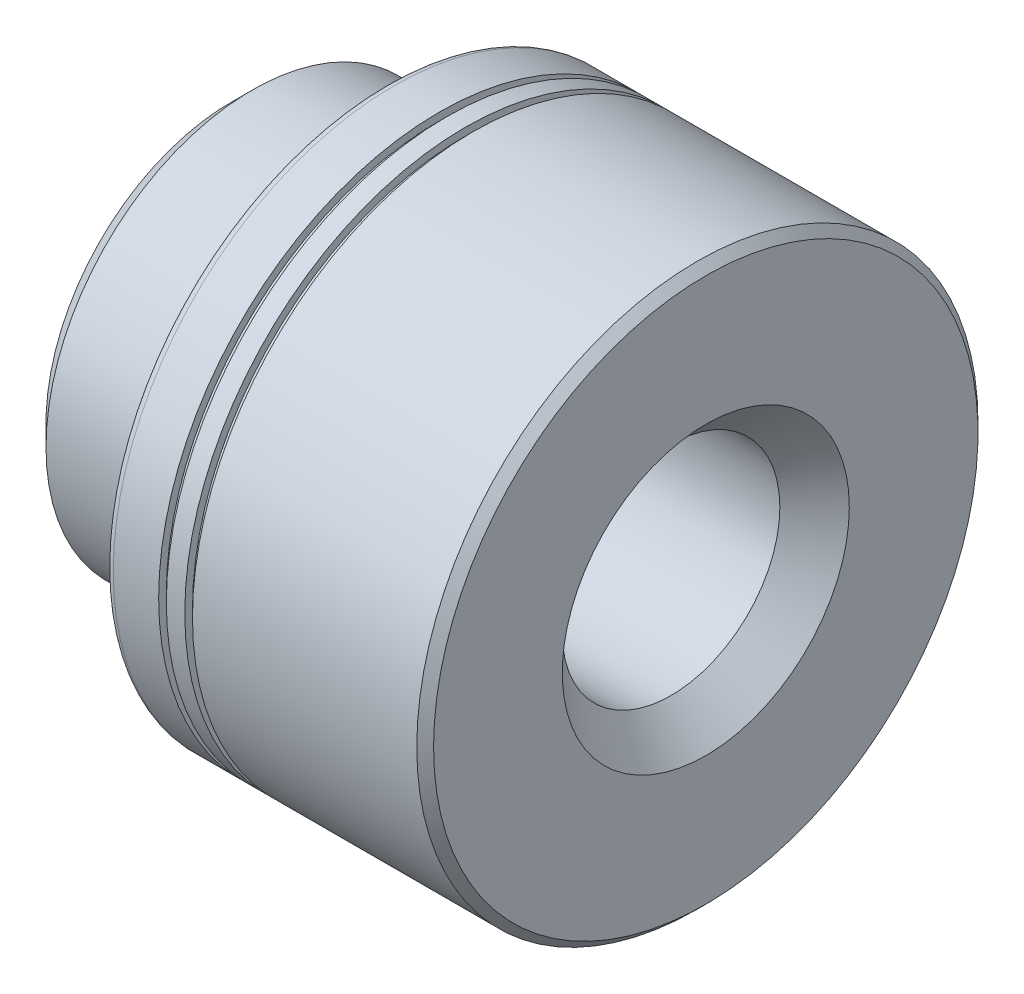
ISO-10303-21;
HEADER;
FILE_DESCRIPTION(('STEP AP214'),'2;1');
FILE_NAME('part.step','',(''),(''),'','','');
FILE_SCHEMA(('AUTOMOTIVE_DESIGN { 1 0 10303 214 1 1 1 1 }'));
ENDSEC;
DATA;
#1=APPLICATION_CONTEXT('core data for automotive mechanical design processes');
#2=APPLICATION_PROTOCOL_DEFINITION('international standard','automotive_design',2000,#1);
#3=PRODUCT_CONTEXT('',#1,'mechanical');
#4=PRODUCT('Part','Part','',(#3));
#5=PRODUCT_RELATED_PRODUCT_CATEGORY('part','',(#4));
#6=PRODUCT_DEFINITION_FORMATION('','',#4);
#7=PRODUCT_DEFINITION_CONTEXT('part definition',#1,'design');
#8=PRODUCT_DEFINITION('design','',#6,#7);
#9=PRODUCT_DEFINITION_SHAPE('','',#8);
#10=(LENGTH_UNIT() NAMED_UNIT(*) SI_UNIT(.MILLI.,.METRE.));
#11=(NAMED_UNIT(*) PLANE_ANGLE_UNIT() SI_UNIT($,.RADIAN.));
#12=(NAMED_UNIT(*) SI_UNIT($,.STERADIAN.) SOLID_ANGLE_UNIT());
#13=UNCERTAINTY_MEASURE_WITH_UNIT(LENGTH_MEASURE(1.E-05),#10,'distance_accuracy_value','');
#14=(GEOMETRIC_REPRESENTATION_CONTEXT(3) GLOBAL_UNCERTAINTY_ASSIGNED_CONTEXT((#13)) GLOBAL_UNIT_ASSIGNED_CONTEXT((#10,
#11,#12)) REPRESENTATION_CONTEXT('',''));
#15=CARTESIAN_POINT('',(0.,0.,0.));
#16=DIRECTION('',(0.,0.,1.));
#17=DIRECTION('',(1.,0.,0.));
#18=AXIS2_PLACEMENT_3D('',#15,#16,#17);
#19=CARTESIAN_POINT('',(1.607439,0.,0.));
#20=DIRECTION('',(-1.,0.,0.));
#21=DIRECTION('',(0.,0.,1.));
#22=AXIS2_PLACEMENT_3D('',#19,#20,#21);
#23=TOROIDAL_SURFACE('',#22,2.697861,0.0834389999999999);
#24=CARTESIAN_POINT('',(1.607439,0.,0.));
#25=DIRECTION('',(-1.,0.,0.));
#26=DIRECTION('',(0.,0.,1.));
#27=AXIS2_PLACEMENT_3D('',#24,#25,#26);
#28=CIRCLE('',#27,2.7813);
#29=CARTESIAN_POINT('',(1.607439,0.,2.7813));
#30=VERTEX_POINT('',#29);
#31=EDGE_CURVE('E44',#30,#30,#28,.F.);
#32=ORIENTED_EDGE('',*,*,#31,.F.);
#33=EDGE_LOOP('',(#32));
#34=FACE_BOUND('',#33,.T.);
#35=CARTESIAN_POINT('',(1.524,0.,0.));
#36=DIRECTION('',(1.,0.,0.));
#37=DIRECTION('',(0.,0.,-1.));
#38=AXIS2_PLACEMENT_3D('',#35,#36,#37);
#39=CIRCLE('',#38,2.697861);
#40=CARTESIAN_POINT('',(1.524,0.,2.697861));
#41=VERTEX_POINT('',#40);
#42=CARTESIAN_POINT('',(1.524,0.,-2.697861));
#43=VERTEX_POINT('',#42);
#44=EDGE_CURVE('E34',#41,#43,#39,.F.);
#45=ORIENTED_EDGE('',*,*,#44,.F.);
#46=CARTESIAN_POINT('',(1.524,0.,0.));
#47=DIRECTION('',(1.,0.,0.));
#48=DIRECTION('',(0.,0.,1.));
#49=AXIS2_PLACEMENT_3D('',#46,#47,#48);
#50=CIRCLE('',#49,2.697861);
#51=EDGE_CURVE('E37',#43,#41,#50,.F.);
#52=ORIENTED_EDGE('',*,*,#51,.F.);
#53=EDGE_LOOP('',(#45,#52));
#54=FACE_BOUND('',#53,.T.);
#55=ADVANCED_FACE('F16',(#34,#54),#23,.T.);
#56=CARTESIAN_POINT('',(1.524,0.,-2.3712805));
#57=DIRECTION('',(-1.,0.,0.));
#58=DIRECTION('',(0.,0.,1.));
#59=AXIS2_PLACEMENT_3D('',#56,#57,#58);
#60=PLANE('',#59);
#61=ORIENTED_EDGE('',*,*,#51,.T.);
#62=ORIENTED_EDGE('',*,*,#44,.T.);
#63=EDGE_LOOP('',(#61,#62));
#64=FACE_BOUND('',#63,.T.);
#65=CARTESIAN_POINT('',(1.524,0.,0.));
#66=DIRECTION('',(-1.,0.,0.));
#67=DIRECTION('',(0.,0.,1.));
#68=AXIS2_PLACEMENT_3D('',#65,#66,#67);
#69=CIRCLE('',#68,2.0447);
#70=CARTESIAN_POINT('',(1.524,0.,2.0447));
#71=VERTEX_POINT('',#70);
#72=EDGE_CURVE('E176',#71,#71,#69,.T.);
#73=ORIENTED_EDGE('',*,*,#72,.F.);
#74=EDGE_LOOP('',(#73));
#75=FACE_BOUND('',#74,.T.);
#76=ADVANCED_FACE('F42',(#64,#75),#60,.T.);
#77=CARTESIAN_POINT('',(1.8324195,0.,0.));
#78=DIRECTION('',(-1.,0.,0.));
#79=DIRECTION('',(0.,0.,1.));
#80=AXIS2_PLACEMENT_3D('',#77,#78,#79);
#81=CYLINDRICAL_SURFACE('',#80,2.7813);
#82=ORIENTED_EDGE('',*,*,#31,.T.);
#83=EDGE_LOOP('',(#82));
#84=FACE_BOUND('',#83,.T.);
#85=CARTESIAN_POINT('',(2.0574,0.,0.));
#86=DIRECTION('',(-1.,0.,0.));
#87=DIRECTION('',(0.,0.,1.));
#88=AXIS2_PLACEMENT_3D('',#85,#86,#87);
#89=CIRCLE('',#88,2.7813);
#90=CARTESIAN_POINT('',(2.0574,0.,2.7813));
#91=VERTEX_POINT('',#90);
#92=EDGE_CURVE('E174',#91,#91,#89,.F.);
#93=ORIENTED_EDGE('',*,*,#92,.F.);
#94=EDGE_LOOP('',(#93));
#95=FACE_BOUND('',#94,.T.);
#96=ADVANCED_FACE('F60',(#84,#95),#81,.T.);
#97=CARTESIAN_POINT('',(0.864235,0.,0.));
#98=DIRECTION('',(-1.,0.,0.));
#99=DIRECTION('',(0.,0.,1.));
#100=AXIS2_PLACEMENT_3D('',#97,#98,#99);
#101=CYLINDRICAL_SURFACE('',#100,2.0447);
#102=CARTESIAN_POINT('',(0.204469999971479,0.,0.));
#103=DIRECTION('',(1.,0.,0.));
#104=DIRECTION('',(0.,0.,-1.));
#105=AXIS2_PLACEMENT_3D('',#102,#103,#104);
#106=CIRCLE('',#105,2.04470000005585);
#107=CARTESIAN_POINT('',(0.204469999971479,0.,-2.04470000005585));
#108=VERTEX_POINT('',#107);
#109=EDGE_CURVE('E173',#108,#108,#106,.F.);
#110=ORIENTED_EDGE('',*,*,#109,.F.);
#111=EDGE_LOOP('',(#110));
#112=FACE_BOUND('',#111,.T.);
#113=ORIENTED_EDGE('',*,*,#72,.T.);
#114=EDGE_LOOP('',(#113));
#115=FACE_BOUND('',#114,.T.);
#116=ADVANCED_FACE('F64',(#112,#115),#101,.T.);
#117=CARTESIAN_POINT('',(2.0574,0.,-2.7432));
#118=DIRECTION('',(1.,0.,0.));
#119=DIRECTION('',(0.,0.,-1.));
#120=AXIS2_PLACEMENT_3D('',#117,#118,#119);
#121=PLANE('',#120);
#122=CARTESIAN_POINT('',(2.0574,0.,0.));
#123=DIRECTION('',(-1.,0.,0.));
#124=DIRECTION('',(0.,0.,1.));
#125=AXIS2_PLACEMENT_3D('',#122,#123,#124);
#126=CIRCLE('',#125,2.7051);
#127=CARTESIAN_POINT('',(2.0574,0.,2.7051));
#128=VERTEX_POINT('',#127);
#129=EDGE_CURVE('E170',#128,#128,#126,.F.);
#130=ORIENTED_EDGE('',*,*,#129,.F.);
#131=EDGE_LOOP('',(#130));
#132=FACE_BOUND('',#131,.T.);
#133=ORIENTED_EDGE('',*,*,#92,.T.);
#134=EDGE_LOOP('',(#133));
#135=FACE_BOUND('',#134,.T.);
#136=ADVANCED_FACE('F68',(#132,#135),#121,.T.);
#137=CARTESIAN_POINT('',(0.204470000085166,0.,0.));
#138=DIRECTION('',(1.,0.,0.));
#139=DIRECTION('',(0.,0.,-1.));
#140=AXIS2_PLACEMENT_3D('',#137,#138,#139);
#141=CONICAL_SURFACE('',#140,2.0447000001127,0.785398163397448);
#142=CARTESIAN_POINT('',(5.68430936001563E-11,0.,0.));
#143=DIRECTION('',(1.,0.,0.));
#144=DIRECTION('',(0.,0.,-1.));
#145=AXIS2_PLACEMENT_3D('',#142,#143,#144);
#146=CIRCLE('',#145,1.84023000008437);
#147=CARTESIAN_POINT('',(5.68432033756262E-11,0.,-1.84023000008437));
#148=VERTEX_POINT('',#147);
#149=EDGE_CURVE('E167',#148,#148,#146,.F.);
#150=ORIENTED_EDGE('',*,*,#149,.F.);
#151=EDGE_LOOP('',(#150));
#152=FACE_BOUND('',#151,.T.);
#153=ORIENTED_EDGE('',*,*,#109,.T.);
#154=EDGE_LOOP('',(#153));
#155=FACE_BOUND('',#154,.T.);
#156=ADVANCED_FACE('F72',(#152,#155),#141,.T.);
#157=CARTESIAN_POINT('',(2.0955,0.,0.));
#158=DIRECTION('',(-1.,0.,0.));
#159=DIRECTION('',(0.,0.,1.));
#160=AXIS2_PLACEMENT_3D('',#157,#158,#159);
#161=CYLINDRICAL_SURFACE('',#160,2.7051);
#162=ORIENTED_EDGE('',*,*,#129,.T.);
#163=EDGE_LOOP('',(#162));
#164=FACE_BOUND('',#163,.T.);
#165=CARTESIAN_POINT('',(2.1336,0.,0.));
#166=DIRECTION('',(-1.,0.,0.));
#167=DIRECTION('',(0.,0.,1.));
#168=AXIS2_PLACEMENT_3D('',#165,#166,#167);
#169=CIRCLE('',#168,2.7051);
#170=CARTESIAN_POINT('',(2.1336,0.,2.7051));
#171=VERTEX_POINT('',#170);
#172=EDGE_CURVE('E164',#171,#171,#169,.F.);
#173=ORIENTED_EDGE('',*,*,#172,.F.);
#174=EDGE_LOOP('',(#173));
#175=FACE_BOUND('',#174,.T.);
#176=ADVANCED_FACE('F76',(#164,#175),#161,.T.);
#177=CARTESIAN_POINT('',(0.,0.,-0.920115));
#178=DIRECTION('',(-1.,0.,0.));
#179=DIRECTION('',(0.,0.,1.));
#180=AXIS2_PLACEMENT_3D('',#177,#178,#179);
#181=PLANE('',#180);
#182=ORIENTED_EDGE('',*,*,#149,.T.);
#183=EDGE_LOOP('',(#182));
#184=FACE_BOUND('',#183,.T.);
#185=CARTESIAN_POINT('',(0.,0.,0.));
#186=DIRECTION('',(-1.,0.,0.));
#187=DIRECTION('',(0.,0.,1.));
#188=AXIS2_PLACEMENT_3D('',#185,#186,#187);
#189=CIRCLE('',#188,1.42239999996718);
#190=CARTESIAN_POINT('',(0.,0.,1.42239999996718));
#191=VERTEX_POINT('',#190);
#192=EDGE_CURVE('E161',#191,#191,#189,.F.);
#193=ORIENTED_EDGE('',*,*,#192,.T.);
#194=EDGE_LOOP('',(#193));
#195=FACE_BOUND('',#194,.T.);
#196=ADVANCED_FACE('F80',(#184,#195),#181,.T.);
#197=CARTESIAN_POINT('',(2.1336,0.,-2.7432));
#198=DIRECTION('',(-1.,0.,0.));
#199=DIRECTION('',(0.,0.,1.));
#200=AXIS2_PLACEMENT_3D('',#197,#198,#199);
#201=PLANE('',#200);
#202=CARTESIAN_POINT('',(2.1336,0.,0.));
#203=DIRECTION('',(-1.,0.,0.));
#204=DIRECTION('',(0.,0.,1.));
#205=AXIS2_PLACEMENT_3D('',#202,#203,#204);
#206=CIRCLE('',#205,2.7813);
#207=CARTESIAN_POINT('',(2.1336,0.,2.7813));
#208=VERTEX_POINT('',#207);
#209=EDGE_CURVE('E158',#208,#208,#206,.F.);
#210=ORIENTED_EDGE('',*,*,#209,.F.);
#211=EDGE_LOOP('',(#210));
#212=FACE_BOUND('',#211,.T.);
#213=ORIENTED_EDGE('',*,*,#172,.T.);
#214=EDGE_LOOP('',(#213));
#215=FACE_BOUND('',#214,.T.);
#216=ADVANCED_FACE('F84',(#212,#215),#201,.T.);
#217=CARTESIAN_POINT('',(5.68431575787964E-11,0.,0.));
#218=DIRECTION('',(-1.,0.,0.));
#219=DIRECTION('',(0.,0.,1.));
#220=AXIS2_PLACEMENT_3D('',#217,#218,#219);
#221=CONICAL_SURFACE('',#220,1.42239999991034,0.785398163480029);
#222=ORIENTED_EDGE('',*,*,#192,.F.);
#223=EDGE_LOOP('',(#222));
#224=FACE_BOUND('',#223,.T.);
#225=CARTESIAN_POINT('',(0.34417,0.,0.));
#226=DIRECTION('',(-1.,0.,0.));
#227=DIRECTION('',(0.,0.,1.));
#228=AXIS2_PLACEMENT_3D('',#225,#226,#227);
#229=CIRCLE('',#228,1.07823);
#230=CARTESIAN_POINT('',(0.34417,0.,1.07823));
#231=VERTEX_POINT('',#230);
#232=EDGE_CURVE('E157',#231,#231,#229,.F.);
#233=ORIENTED_EDGE('',*,*,#232,.T.);
#234=EDGE_LOOP('',(#233));
#235=FACE_BOUND('',#234,.T.);
#236=ADVANCED_FACE('F88',(#224,#235),#221,.F.);
#237=CARTESIAN_POINT('',(2.22504,0.,0.));
#238=DIRECTION('',(-1.,0.,0.));
#239=DIRECTION('',(0.,0.,1.));
#240=AXIS2_PLACEMENT_3D('',#237,#238,#239);
#241=CYLINDRICAL_SURFACE('',#240,2.7813);
#242=ORIENTED_EDGE('',*,*,#209,.T.);
#243=EDGE_LOOP('',(#242));
#244=FACE_BOUND('',#243,.T.);
#245=CARTESIAN_POINT('',(2.31648,0.,0.));
#246=DIRECTION('',(-1.,0.,0.));
#247=DIRECTION('',(0.,0.,1.));
#248=AXIS2_PLACEMENT_3D('',#245,#246,#247);
#249=CIRCLE('',#248,2.7813);
#250=CARTESIAN_POINT('',(2.31648,0.,2.7813));
#251=VERTEX_POINT('',#250);
#252=EDGE_CURVE('E154',#251,#251,#249,.F.);
#253=ORIENTED_EDGE('',*,*,#252,.F.);
#254=EDGE_LOOP('',(#253));
#255=FACE_BOUND('',#254,.T.);
#256=ADVANCED_FACE('F92',(#244,#255),#241,.T.);
#257=CARTESIAN_POINT('',(2.3495,0.,0.));
#258=DIRECTION('',(-1.,0.,0.));
#259=DIRECTION('',(0.,0.,1.));
#260=AXIS2_PLACEMENT_3D('',#257,#258,#259);
#261=CYLINDRICAL_SURFACE('',#260,1.07823);
#262=ORIENTED_EDGE('',*,*,#232,.F.);
#263=EDGE_LOOP('',(#262));
#264=FACE_BOUND('',#263,.T.);
#265=CARTESIAN_POINT('',(4.35483000001113,0.,0.));
#266=DIRECTION('',(1.,0.,0.));
#267=DIRECTION('',(0.,0.,-1.));
#268=AXIS2_PLACEMENT_3D('',#265,#266,#267);
#269=CIRCLE('',#268,1.07822999996188);
#270=CARTESIAN_POINT('',(4.35483000001113,0.,-1.07822999996188));
#271=VERTEX_POINT('',#270);
#272=EDGE_CURVE('E153',#271,#271,#269,.T.);
#273=ORIENTED_EDGE('',*,*,#272,.T.);
#274=EDGE_LOOP('',(#273));
#275=FACE_BOUND('',#274,.T.);
#276=ADVANCED_FACE('F96',(#264,#275),#261,.F.);
#277=CARTESIAN_POINT('',(2.31648,0.,-2.7432));
#278=DIRECTION('',(1.,0.,0.));
#279=DIRECTION('',(0.,0.,-1.));
#280=AXIS2_PLACEMENT_3D('',#277,#278,#279);
#281=PLANE('',#280);
#282=CARTESIAN_POINT('',(2.31648,0.,0.));
#283=DIRECTION('',(-1.,0.,0.));
#284=DIRECTION('',(0.,0.,1.));
#285=AXIS2_PLACEMENT_3D('',#282,#283,#284);
#286=CIRCLE('',#285,2.7051);
#287=CARTESIAN_POINT('',(2.31648,0.,2.7051));
#288=VERTEX_POINT('',#287);
#289=EDGE_CURVE('E150',#288,#288,#286,.F.);
#290=ORIENTED_EDGE('',*,*,#289,.F.);
#291=EDGE_LOOP('',(#290));
#292=FACE_BOUND('',#291,.T.);
#293=ORIENTED_EDGE('',*,*,#252,.T.);
#294=EDGE_LOOP('',(#293));
#295=FACE_BOUND('',#294,.T.);
#296=ADVANCED_FACE('F100',(#292,#295),#281,.T.);
#297=CARTESIAN_POINT('',(4.69900000001644,0.,0.));
#298=DIRECTION('',(1.,0.,0.));
#299=DIRECTION('',(0.,0.,-1.));
#300=AXIS2_PLACEMENT_3D('',#297,#298,#299);
#301=CONICAL_SURFACE('',#300,1.42239999996718,0.785398163397448);
#302=ORIENTED_EDGE('',*,*,#272,.F.);
#303=EDGE_LOOP('',(#302));
#304=FACE_BOUND('',#303,.T.);
#305=CARTESIAN_POINT('',(4.69900000001644,0.,0.));
#306=DIRECTION('',(1.,0.,0.));
#307=DIRECTION('',(0.,0.,-1.));
#308=AXIS2_PLACEMENT_3D('',#305,#306,#307);
#309=CIRCLE('',#308,1.42239999996718);
#310=CARTESIAN_POINT('',(4.69900000001644,0.,-1.42239999996718));
#311=VERTEX_POINT('',#310);
#312=EDGE_CURVE('E147',#311,#311,#309,.F.);
#313=ORIENTED_EDGE('',*,*,#312,.F.);
#314=EDGE_LOOP('',(#313));
#315=FACE_BOUND('',#314,.T.);
#316=ADVANCED_FACE('F104',(#304,#315),#301,.F.);
#317=CARTESIAN_POINT('',(2.35458,0.,0.));
#318=DIRECTION('',(-1.,0.,0.));
#319=DIRECTION('',(0.,0.,1.));
#320=AXIS2_PLACEMENT_3D('',#317,#318,#319);
#321=CYLINDRICAL_SURFACE('',#320,2.7051);
#322=ORIENTED_EDGE('',*,*,#289,.T.);
#323=EDGE_LOOP('',(#322));
#324=FACE_BOUND('',#323,.T.);
#325=CARTESIAN_POINT('',(2.39268,0.,0.));
#326=DIRECTION('',(-1.,0.,0.));
#327=DIRECTION('',(0.,0.,1.));
#328=AXIS2_PLACEMENT_3D('',#325,#326,#327);
#329=CIRCLE('',#328,2.7051);
#330=CARTESIAN_POINT('',(2.39268,0.,2.7051));
#331=VERTEX_POINT('',#330);
#332=EDGE_CURVE('E139',#331,#331,#329,.F.);
#333=ORIENTED_EDGE('',*,*,#332,.F.);
#334=EDGE_LOOP('',(#333));
#335=FACE_BOUND('',#334,.T.);
#336=ADVANCED_FACE('F108',(#324,#335),#321,.T.);
#337=CARTESIAN_POINT('',(4.699,0.,-1.3489305));
#338=DIRECTION('',(1.,0.,0.));
#339=DIRECTION('',(0.,0.,-1.));
#340=AXIS2_PLACEMENT_3D('',#337,#338,#339);
#341=PLANE('',#340);
#342=CARTESIAN_POINT('',(4.6989999999596,0.,0.));
#343=DIRECTION('',(-1.,0.,0.));
#344=DIRECTION('',(0.,0.,1.));
#345=AXIS2_PLACEMENT_3D('',#342,#343,#344);
#346=CIRCLE('',#345,2.69786100005831);
#347=CARTESIAN_POINT('',(4.6989999999596,0.,2.69786100005831));
#348=VERTEX_POINT('',#347);
#349=EDGE_CURVE('E136',#348,#348,#346,.T.);
#350=ORIENTED_EDGE('',*,*,#349,.F.);
#351=EDGE_LOOP('',(#350));
#352=FACE_BOUND('',#351,.T.);
#353=ORIENTED_EDGE('',*,*,#312,.T.);
#354=EDGE_LOOP('',(#353));
#355=FACE_BOUND('',#354,.T.);
#356=ADVANCED_FACE('F112',(#352,#355),#341,.T.);
#357=CARTESIAN_POINT('',(2.39268,0.,-2.7432));
#358=DIRECTION('',(-1.,0.,0.));
#359=DIRECTION('',(0.,0.,1.));
#360=AXIS2_PLACEMENT_3D('',#357,#358,#359);
#361=PLANE('',#360);
#362=CARTESIAN_POINT('',(2.39268,0.,0.));
#363=DIRECTION('',(-1.,0.,0.));
#364=DIRECTION('',(0.,0.,1.));
#365=AXIS2_PLACEMENT_3D('',#362,#363,#364);
#366=CIRCLE('',#365,2.7813);
#367=CARTESIAN_POINT('',(2.39268,0.,2.7813));
#368=VERTEX_POINT('',#367);
#369=EDGE_CURVE('E27',#368,#368,#366,.F.);
#370=ORIENTED_EDGE('',*,*,#369,.F.);
#371=EDGE_LOOP('',(#370));
#372=FACE_BOUND('',#371,.T.);
#373=ORIENTED_EDGE('',*,*,#332,.T.);
#374=EDGE_LOOP('',(#373));
#375=FACE_BOUND('',#374,.T.);
#376=ADVANCED_FACE('F116',(#372,#375),#361,.T.);
#377=CARTESIAN_POINT('',(4.61556099980953,0.,0.));
#378=DIRECTION('',(-1.,0.,0.));
#379=DIRECTION('',(0.,0.,1.));
#380=AXIS2_PLACEMENT_3D('',#377,#378,#379);
#381=CONICAL_SURFACE('',#380,2.78130000020838,0.785398163397448);
#382=ORIENTED_EDGE('',*,*,#349,.T.);
#383=EDGE_LOOP('',(#382));
#384=FACE_BOUND('',#383,.T.);
#385=CARTESIAN_POINT('',(4.615561,0.,0.));
#386=DIRECTION('',(-1.,0.,0.));
#387=DIRECTION('',(0.,0.,1.));
#388=AXIS2_PLACEMENT_3D('',#385,#386,#387);
#389=CIRCLE('',#388,2.7813);
#390=CARTESIAN_POINT('',(4.615561,0.,2.7813));
#391=VERTEX_POINT('',#390);
#392=EDGE_CURVE('E11',#391,#391,#389,.T.);
#393=ORIENTED_EDGE('',*,*,#392,.F.);
#394=EDGE_LOOP('',(#393));
#395=FACE_BOUND('',#394,.T.);
#396=ADVANCED_FACE('F120',(#384,#395),#381,.T.);
#397=CARTESIAN_POINT('',(3.5041205,0.,0.));
#398=DIRECTION('',(-1.,0.,0.));
#399=DIRECTION('',(0.,0.,1.));
#400=AXIS2_PLACEMENT_3D('',#397,#398,#399);
#401=CYLINDRICAL_SURFACE('',#400,2.7813);
#402=ORIENTED_EDGE('',*,*,#369,.T.);
#403=EDGE_LOOP('',(#402));
#404=FACE_BOUND('',#403,.T.);
#405=ORIENTED_EDGE('',*,*,#392,.T.);
#406=EDGE_LOOP('',(#405));
#407=FACE_BOUND('',#406,.T.);
#408=ADVANCED_FACE('F124',(#404,#407),#401,.T.);
#409=CLOSED_SHELL('',(#55,#76,#96,#116,#136,#156,#176,#196,#216,#236,#256,#276,#296,#316,#336,
#356,#376,#396,#408));
#410=MANIFOLD_SOLID_BREP('B1',#409);
#411=ADVANCED_BREP_SHAPE_REPRESENTATION('',(#18,#410),#14);
#412=SHAPE_DEFINITION_REPRESENTATION(#9,#411);
ENDSEC;
END-ISO-10303-21;
